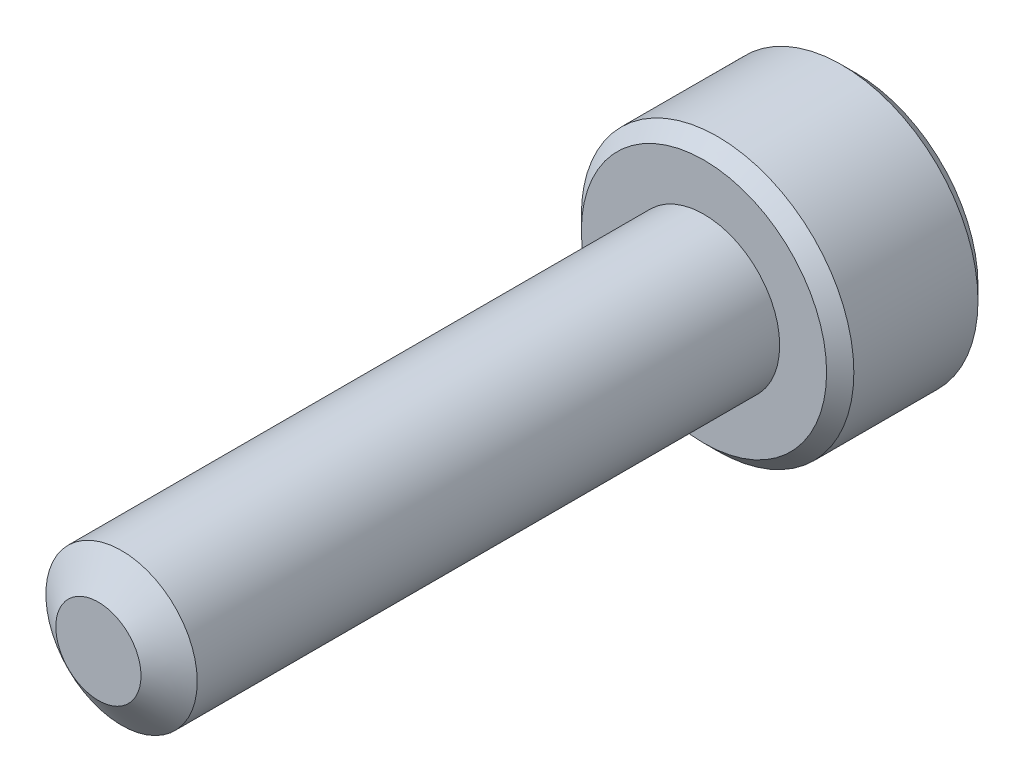
ISO-10303-21;
HEADER;
FILE_DESCRIPTION(('STEP AP214'),'2;1');
FILE_NAME('part.step','',(''),(''),'','','');
FILE_SCHEMA(('AUTOMOTIVE_DESIGN { 1 0 10303 214 1 1 1 1 }'));
ENDSEC;
DATA;
#1=APPLICATION_CONTEXT('core data for automotive mechanical design processes');
#2=APPLICATION_PROTOCOL_DEFINITION('international standard','automotive_design',2000,#1);
#3=PRODUCT_CONTEXT('',#1,'mechanical');
#4=PRODUCT('Part','Part','',(#3));
#5=PRODUCT_RELATED_PRODUCT_CATEGORY('part','',(#4));
#6=PRODUCT_DEFINITION_FORMATION('','',#4);
#7=PRODUCT_DEFINITION_CONTEXT('part definition',#1,'design');
#8=PRODUCT_DEFINITION('design','',#6,#7);
#9=PRODUCT_DEFINITION_SHAPE('','',#8);
#10=(LENGTH_UNIT() NAMED_UNIT(*) SI_UNIT(.MILLI.,.METRE.));
#11=(NAMED_UNIT(*) PLANE_ANGLE_UNIT() SI_UNIT($,.RADIAN.));
#12=(NAMED_UNIT(*) SI_UNIT($,.STERADIAN.) SOLID_ANGLE_UNIT());
#13=UNCERTAINTY_MEASURE_WITH_UNIT(LENGTH_MEASURE(1.E-05),#10,'distance_accuracy_value','');
#14=(GEOMETRIC_REPRESENTATION_CONTEXT(3) GLOBAL_UNCERTAINTY_ASSIGNED_CONTEXT((#13)) GLOBAL_UNIT_ASSIGNED_CONTEXT((#10,
#11,#12)) REPRESENTATION_CONTEXT('',''));
#15=CARTESIAN_POINT('',(0.,0.,0.));
#16=DIRECTION('',(0.,0.,1.));
#17=DIRECTION('',(1.,0.,0.));
#18=AXIS2_PLACEMENT_3D('',#15,#16,#17);
#19=CARTESIAN_POINT('',(0.,0.,-9.99999999999999));
#20=DIRECTION('',(0.,0.,1.));
#21=DIRECTION('',(1.00000000000001,0.,0.));
#22=AXIS2_PLACEMENT_3D('',#19,#20,#21);
#23=CYLINDRICAL_SURFACE('',#22,1.25);
#24=CARTESIAN_POINT('',(0.,0.,-9.99999999999999));
#25=DIRECTION('',(0.,0.,-1.));
#26=DIRECTION('',(-1.00000000000001,0.,0.));
#27=AXIS2_PLACEMENT_3D('',#24,#25,#26);
#28=CIRCLE('',#27,1.25);
#29=CARTESIAN_POINT('',(1.25000000000001,0.,-9.99999999999999));
#30=VERTEX_POINT('',#29);
#31=EDGE_CURVE('E212',#30,#30,#28,.F.);
#32=CARTESIAN_POINT('',(0.,0.,-0.382511876358974));
#33=DIRECTION('',(0.,0.,1.));
#34=DIRECTION('',(1.00000000000001,0.,0.));
#35=AXIS2_PLACEMENT_3D('',#32,#33,#34);
#36=CIRCLE('',#35,1.25);
#37=CARTESIAN_POINT('',(1.25000000000001,0.,-0.382511876358975));
#38=VERTEX_POINT('',#37);
#39=EDGE_CURVE('E106',#38,#38,#36,.T.);
#40=CARTESIAN_POINT('',(1.25000000000001,0.,-9.99999999999999));
#41=CARTESIAN_POINT('',(1.25000000000001,0.,-9.8998178320454));
#42=CARTESIAN_POINT('',(1.25000000000001,0.,-9.7996356640908));
#43=CARTESIAN_POINT('',(1.25000000000001,0.,-9.59927132818161));
#44=CARTESIAN_POINT('',(1.25000000000001,0.,-9.49908916022702));
#45=CARTESIAN_POINT('',(1.25000000000001,0.,-9.29872482431783));
#46=CARTESIAN_POINT('',(1.25000000000001,0.,-9.19854265636324));
#47=CARTESIAN_POINT('',(1.25000000000001,0.,-8.99817832045405));
#48=CARTESIAN_POINT('',(1.25000000000001,0.,-8.89799615249946));
#49=CARTESIAN_POINT('',(1.25000000000001,0.,-8.69763181659027));
#50=CARTESIAN_POINT('',(1.25000000000001,0.,-8.59744964863567));
#51=CARTESIAN_POINT('',(1.25000000000001,0.,-8.39708531272649));
#52=CARTESIAN_POINT('',(1.25000000000001,0.,-8.29690314477189));
#53=CARTESIAN_POINT('',(1.25000000000001,0.,-8.0965388088627));
#54=CARTESIAN_POINT('',(1.25000000000001,0.,-7.99635664090811));
#55=CARTESIAN_POINT('',(1.25000000000001,0.,-7.79599230499892));
#56=CARTESIAN_POINT('',(1.25000000000001,0.,-7.69581013704433));
#57=CARTESIAN_POINT('',(1.25000000000001,0.,-7.49544580113514));
#58=CARTESIAN_POINT('',(1.25000000000001,0.,-7.39526363318055));
#59=CARTESIAN_POINT('',(1.25000000000001,0.,-7.19489929727136));
#60=CARTESIAN_POINT('',(1.25000000000001,0.,-7.09471712931677));
#61=CARTESIAN_POINT('',(1.25000000000001,0.,-6.89435279340758));
#62=CARTESIAN_POINT('',(1.25000000000001,0.,-6.79417062545298));
#63=CARTESIAN_POINT('',(1.25000000000001,0.,-6.5938062895438));
#64=CARTESIAN_POINT('',(1.25000000000001,0.,-6.4936241215892));
#65=CARTESIAN_POINT('',(1.25000000000001,0.,-6.29325978568002));
#66=CARTESIAN_POINT('',(1.25000000000001,0.,-6.19307761772542));
#67=CARTESIAN_POINT('',(1.25000000000001,0.,-5.99271328181623));
#68=CARTESIAN_POINT('',(1.25000000000001,0.,-5.89253111386164));
#69=CARTESIAN_POINT('',(1.25000000000001,0.,-5.69216677795245));
#70=CARTESIAN_POINT('',(1.25000000000001,0.,-5.59198460999786));
#71=CARTESIAN_POINT('',(1.25000000000001,0.,-5.39162027408867));
#72=CARTESIAN_POINT('',(1.25000000000001,0.,-5.29143810613408));
#73=CARTESIAN_POINT('',(1.25000000000001,0.,-5.09107377022489));
#74=CARTESIAN_POINT('',(1.25000000000001,0.,-4.99089160227029));
#75=CARTESIAN_POINT('',(1.25000000000001,0.,-4.79052726636111));
#76=CARTESIAN_POINT('',(1.25000000000001,0.,-4.69034509840651));
#77=CARTESIAN_POINT('',(1.25000000000001,0.,-4.48998076249732));
#78=CARTESIAN_POINT('',(1.25000000000001,0.,-4.38979859454273));
#79=CARTESIAN_POINT('',(1.25000000000001,0.,-4.18943425863354));
#80=CARTESIAN_POINT('',(1.25000000000001,0.,-4.08925209067895));
#81=CARTESIAN_POINT('',(1.25000000000001,0.,-3.88888775476976));
#82=CARTESIAN_POINT('',(1.25000000000001,0.,-3.78870558681517));
#83=CARTESIAN_POINT('',(1.25000000000001,0.,-3.58834125090598));
#84=CARTESIAN_POINT('',(1.25000000000001,0.,-3.48815908295139));
#85=CARTESIAN_POINT('',(1.25000000000001,0.,-3.2877947470422));
#86=CARTESIAN_POINT('',(1.25000000000001,0.,-3.1876125790876));
#87=CARTESIAN_POINT('',(1.25000000000001,0.,-2.98724824317841));
#88=CARTESIAN_POINT('',(1.25000000000001,0.,-2.88706607522382));
#89=CARTESIAN_POINT('',(1.25000000000001,0.,-2.68670173931463));
#90=CARTESIAN_POINT('',(1.25000000000001,0.,-2.58651957136004));
#91=CARTESIAN_POINT('',(1.25000000000001,0.,-2.38615523545085));
#92=CARTESIAN_POINT('',(1.25000000000001,0.,-2.28597306749626));
#93=CARTESIAN_POINT('',(1.25000000000001,0.,-2.08560873158707));
#94=CARTESIAN_POINT('',(1.25000000000001,0.,-1.98542656363248));
#95=CARTESIAN_POINT('',(1.25000000000001,0.,-1.78506222772329));
#96=CARTESIAN_POINT('',(1.25000000000001,0.,-1.6848800597687));
#97=CARTESIAN_POINT('',(1.25000000000001,0.,-1.48451572385951));
#98=CARTESIAN_POINT('',(1.25000000000001,0.,-1.38433355590491));
#99=CARTESIAN_POINT('',(1.25000000000001,0.,-1.18396921999573));
#100=CARTESIAN_POINT('',(1.25000000000001,0.,-1.08378705204113));
#101=CARTESIAN_POINT('',(1.25000000000001,0.,-0.883422716131945));
#102=CARTESIAN_POINT('',(1.25000000000001,0.,-0.783240548177351));
#103=CARTESIAN_POINT('',(1.25000000000001,0.,-0.582876212268163));
#104=CARTESIAN_POINT('',(1.25000000000001,0.,-0.482694044313569));
#105=CARTESIAN_POINT('',(1.25000000000001,0.,-0.382511876358975));
#106=B_SPLINE_CURVE_WITH_KNOTS('',3,(#40,#41,#42,#43,#44,#45,#46,#47,#48,#49,#50,#51,#52,#53,
#54,#55,#56,#57,#58,#59,#60,#61,#62,#63,#64,#65,#66,#67,#68,#69,#70,#71,#72,#73,#74,#75,#76,#77,
#78,#79,#80,#81,#82,#83,#84,#85,#86,#87,#88,#89,#90,#91,#92,#93,#94,#95,#96,#97,#98,#99,#100,
#101,#102,#103,#104,#105),.UNSPECIFIED.,.F.,.F.,(4,2,2,2,2,2,2,2,2,2,2,2,2,2,2,2,2,2,2,2,2,2,2,
2,2,2,2,2,2,2,2,2,4),(0.,0.300546503863783,0.601093007727564,0.901639511591347,1.20218601545513,
1.50273251931891,1.80327902318269,2.10382552704647,2.40437203091025,2.70491853477404,
3.00546503863782,3.3060115425016,3.60655804636538,3.90710455022916,4.20765105409294,
4.50819755795673,4.80874406182051,5.10929056568429,5.40983706954807,5.71038357341185,
6.01093007727563,6.31147658113942,6.6120230850032,6.91256958886698,7.21311609273076,
7.51366259659454,7.81420910045832,8.11475560432211,8.41530210818589,8.71584861204967,
9.01639511591345,9.31694161977723,9.61748812364101),.UNSPECIFIED.);
#107=EDGE_CURVE('BSEAM32',#30,#38,#106,.T.);
#108=ORIENTED_EDGE('',*,*,#31,.T.);
#109=ORIENTED_EDGE('',*,*,#39,.F.);
#110=ORIENTED_EDGE('',*,*,#107,.T.);
#111=ORIENTED_EDGE('',*,*,#107,.F.);
#112=EDGE_LOOP('',(#108,#110,#109,#111));
#113=FACE_BOUND('',#112,.T.);
#114=ADVANCED_FACE('F32',(#113),#23,.T.);
#115=CARTESIAN_POINT('',(0.,0.,0.));
#116=DIRECTION('',(0.,0.,-1.));
#117=DIRECTION('',(-1.00000000000001,0.,0.));
#118=AXIS2_PLACEMENT_3D('',#115,#116,#117);
#119=CONICAL_SURFACE('',#118,0.70371642622275,0.959931088596884);
#120=ORIENTED_EDGE('',*,*,#39,.T.);
#121=EDGE_LOOP('',(#120));
#122=FACE_BOUND('',#121,.T.);
#123=CARTESIAN_POINT('',(0.,0.,0.));
#124=DIRECTION('',(0.,0.,1.));
#125=DIRECTION('',(1.00000000000001,0.,0.));
#126=AXIS2_PLACEMENT_3D('',#123,#124,#125);
#127=CIRCLE('',#126,0.70371642622275);
#128=CARTESIAN_POINT('',(0.703716426222755,0.,0.));
#129=VERTEX_POINT('',#128);
#130=EDGE_CURVE('E210',#129,#129,#127,.T.);
#131=ORIENTED_EDGE('',*,*,#130,.F.);
#132=EDGE_LOOP('',(#131));
#133=FACE_BOUND('',#132,.T.);
#134=ADVANCED_FACE('F193',(#122,#133),#119,.T.);
#135=CARTESIAN_POINT('',(0.,0.,0.));
#136=DIRECTION('',(0.,0.,1.));
#137=DIRECTION('',(1.00000000000001,0.,0.));
#138=AXIS2_PLACEMENT_3D('',#135,#136,#137);
#139=PLANE('',#138);
#140=ORIENTED_EDGE('',*,*,#130,.T.);
#141=EDGE_LOOP('',(#140));
#142=FACE_BOUND('',#141,.T.);
#143=ADVANCED_FACE('F190',(#142),#139,.T.);
#144=CARTESIAN_POINT('',(0.,1.38777878078145E-13,-12.5000000000001));
#145=DIRECTION('',(0.,0.,1.));
#146=DIRECTION('',(1.00000000000001,0.,0.));
#147=AXIS2_PLACEMENT_3D('',#144,#145,#146);
#148=CYLINDRICAL_SURFACE('',#147,2.25);
#149=CARTESIAN_POINT('',(0.,1.38777878078145E-13,-12.275));
#150=DIRECTION('',(0.,0.,-1.));
#151=DIRECTION('',(-1.00000000000001,0.,0.));
#152=AXIS2_PLACEMENT_3D('',#149,#150,#151);
#153=CIRCLE('',#152,2.25);
#154=CARTESIAN_POINT('',(2.25,1.40282924165902E-13,-12.275));
#155=VERTEX_POINT('',#154);
#156=EDGE_CURVE('E40',#155,#155,#153,.F.);
#157=CARTESIAN_POINT('',(0.,1.76941794549634E-13,-10.225));
#158=DIRECTION('',(0.,0.,-1.));
#159=DIRECTION('',(-1.00000000000001,0.,0.));
#160=AXIS2_PLACEMENT_3D('',#157,#158,#159);
#161=CIRCLE('',#160,2.25);
#162=CARTESIAN_POINT('',(2.25,1.40339823095914E-13,-10.225));
#163=VERTEX_POINT('',#162);
#164=EDGE_CURVE('E169',#163,#163,#161,.T.);
#165=CARTESIAN_POINT('',(2.25,1.40282924165902E-13,-12.275));
#166=CARTESIAN_POINT('',(2.25,1.4028351686309E-13,-12.2536458333334));
#167=CARTESIAN_POINT('',(2.25,1.40284109560277E-13,-12.2322916666667));
#168=CARTESIAN_POINT('',(2.25,1.40285294954653E-13,-12.1895833333334));
#169=CARTESIAN_POINT('',(2.25,1.4028588765184E-13,-12.1682291666667));
#170=CARTESIAN_POINT('',(2.25,1.40287073046215E-13,-12.1255208333334));
#171=CARTESIAN_POINT('',(2.25,1.40287665743403E-13,-12.1041666666667));
#172=CARTESIAN_POINT('',(2.25,1.40288851137778E-13,-12.0614583333334));
#173=CARTESIAN_POINT('',(2.25,1.40289443834966E-13,-12.0401041666667));
#174=CARTESIAN_POINT('',(2.25,1.40290629229341E-13,-11.9973958333334));
#175=CARTESIAN_POINT('',(2.25,1.40291221926529E-13,-11.9760416666667));
#176=CARTESIAN_POINT('',(2.25,1.40292407320904E-13,-11.9333333333334));
#177=CARTESIAN_POINT('',(2.25,1.40293000018092E-13,-11.9119791666667));
#178=CARTESIAN_POINT('',(2.25,1.40294185412467E-13,-11.8692708333334));
#179=CARTESIAN_POINT('',(2.25,1.40294778109655E-13,-11.8479166666667));
#180=CARTESIAN_POINT('',(2.25,1.4029596350403E-13,-11.8052083333334));
#181=CARTESIAN_POINT('',(2.25,1.40296556201217E-13,-11.7838541666667));
#182=CARTESIAN_POINT('',(2.25,1.40297741595593E-13,-11.7411458333334));
#183=CARTESIAN_POINT('',(2.25,1.4029833429278E-13,-11.7197916666667));
#184=CARTESIAN_POINT('',(2.25,1.40299519687156E-13,-11.6770833333334));
#185=CARTESIAN_POINT('',(2.25,1.40300112384343E-13,-11.6557291666667));
#186=CARTESIAN_POINT('',(2.25,1.40301297778718E-13,-11.6130208333334));
#187=CARTESIAN_POINT('',(2.25,1.40301890475906E-13,-11.5916666666667));
#188=CARTESIAN_POINT('',(2.25,1.40303075870281E-13,-11.5489583333334));
#189=CARTESIAN_POINT('',(2.25,1.40303668567469E-13,-11.5276041666667));
#190=CARTESIAN_POINT('',(2.25,1.40304853961844E-13,-11.4848958333334));
#191=CARTESIAN_POINT('',(2.25,1.40305446659032E-13,-11.4635416666667));
#192=CARTESIAN_POINT('',(2.25,1.40306632053407E-13,-11.4208333333334));
#193=CARTESIAN_POINT('',(2.25,1.40307224750595E-13,-11.3994791666667));
#194=CARTESIAN_POINT('',(2.25,1.4030841014497E-13,-11.3567708333334));
#195=CARTESIAN_POINT('',(2.25,1.40309002842158E-13,-11.3354166666667));
#196=CARTESIAN_POINT('',(2.25,1.40310188236533E-13,-11.2927083333334));
#197=CARTESIAN_POINT('',(2.25,1.4031078093372E-13,-11.2713541666667));
#198=CARTESIAN_POINT('',(2.25,1.40311966328096E-13,-11.2286458333334));
#199=CARTESIAN_POINT('',(2.25,1.40312559025283E-13,-11.2072916666667));
#200=CARTESIAN_POINT('',(2.25,1.40313744419659E-13,-11.1645833333334));
#201=CARTESIAN_POINT('',(2.25,1.40314337116846E-13,-11.1432291666667));
#202=CARTESIAN_POINT('',(2.25,1.40315522511221E-13,-11.1005208333334));
#203=CARTESIAN_POINT('',(2.25,1.40316115208409E-13,-11.0791666666667));
#204=CARTESIAN_POINT('',(2.25,1.40317300602784E-13,-11.0364583333334));
#205=CARTESIAN_POINT('',(2.25,1.40317893299972E-13,-11.0151041666667));
#206=CARTESIAN_POINT('',(2.25,1.40319078694347E-13,-10.9723958333334));
#207=CARTESIAN_POINT('',(2.25,1.40319671391535E-13,-10.9510416666667));
#208=CARTESIAN_POINT('',(2.25,1.4032085678591E-13,-10.9083333333334));
#209=CARTESIAN_POINT('',(2.25,1.40321449483098E-13,-10.8869791666667));
#210=CARTESIAN_POINT('',(2.25,1.40322634877473E-13,-10.8442708333334));
#211=CARTESIAN_POINT('',(2.25,1.40323227574661E-13,-10.8229166666667));
#212=CARTESIAN_POINT('',(2.25,1.40324412969036E-13,-10.7802083333334));
#213=CARTESIAN_POINT('',(2.25,1.40325005666223E-13,-10.7588541666667));
#214=CARTESIAN_POINT('',(2.25,1.40326191060599E-13,-10.7161458333334));
#215=CARTESIAN_POINT('',(2.25,1.40326783757786E-13,-10.6947916666667));
#216=CARTESIAN_POINT('',(2.25,1.40327969152162E-13,-10.6520833333334));
#217=CARTESIAN_POINT('',(2.25,1.40328561849349E-13,-10.6307291666667));
#218=CARTESIAN_POINT('',(2.25,1.40329747243724E-13,-10.5880208333334));
#219=CARTESIAN_POINT('',(2.25,1.40330339940912E-13,-10.5666666666667));
#220=CARTESIAN_POINT('',(2.25,1.40331525335287E-13,-10.5239583333334));
#221=CARTESIAN_POINT('',(2.25,1.40332118032475E-13,-10.5026041666667));
#222=CARTESIAN_POINT('',(2.25,1.4033330342685E-13,-10.4598958333334));
#223=CARTESIAN_POINT('',(2.25,1.40333896124038E-13,-10.4385416666667));
#224=CARTESIAN_POINT('',(2.25,1.40335081518413E-13,-10.3958333333334));
#225=CARTESIAN_POINT('',(2.25,1.40335674215601E-13,-10.3744791666667));
#226=CARTESIAN_POINT('',(2.25,1.40336859609976E-13,-10.3317708333334));
#227=CARTESIAN_POINT('',(2.25,1.40337452307164E-13,-10.3104166666667));
#228=CARTESIAN_POINT('',(2.25,1.40338637701539E-13,-10.2677083333334));
#229=CARTESIAN_POINT('',(2.25,1.40339230398726E-13,-10.2463541666667));
#230=CARTESIAN_POINT('',(2.25,1.40339823095914E-13,-10.225));
#231=B_SPLINE_CURVE_WITH_KNOTS('',3,(#165,#166,#167,#168,#169,#170,#171,#172,#173,#174,#175,
#176,#177,#178,#179,#180,#181,#182,#183,#184,#185,#186,#187,#188,#189,#190,#191,#192,#193,#194,
#195,#196,#197,#198,#199,#200,#201,#202,#203,#204,#205,#206,#207,#208,#209,#210,#211,#212,#213,
#214,#215,#216,#217,#218,#219,#220,#221,#222,#223,#224,#225,#226,#227,#228,#229,#230),
.UNSPECIFIED.,.F.,.F.,(4,2,2,2,2,2,2,2,2,2,2,2,2,2,2,2,2,2,2,2,2,2,2,2,2,2,2,2,2,2,2,2,4),(0.,
0.0640624999999999,0.128124999999998,0.192187499999998,0.256249999999996,0.320312499999996,
0.384374999999994,0.448437499999994,0.512499999999992,0.576562499999992,0.64062499999999,
0.70468749999999,0.768749999999988,0.832812499999988,0.896874999999986,0.960937499999986,
1.02499999999998,1.08906249999998,1.15312499999998,1.21718749999998,1.28124999999998,
1.34531249999998,1.40937499999998,1.47343749999998,1.53749999999998,1.60156249999998,
1.66562499999997,1.72968749999997,1.79374999999997,1.85781249999997,1.92187499999997,
1.98593749999997,2.04999999999997),.UNSPECIFIED.);
#232=EDGE_CURVE('BSEAM174',#155,#163,#231,.T.);
#233=ORIENTED_EDGE('',*,*,#156,.T.);
#234=ORIENTED_EDGE('',*,*,#164,.T.);
#235=ORIENTED_EDGE('',*,*,#232,.T.);
#236=ORIENTED_EDGE('',*,*,#232,.F.);
#237=EDGE_LOOP('',(#233,#235,#234,#236));
#238=FACE_BOUND('',#237,.T.);
#239=ADVANCED_FACE('F174',(#238),#148,.T.);
#240=CARTESIAN_POINT('',(0.,1.38777878078145E-13,-12.5000000000001));
#241=DIRECTION('',(0.,0.,-1.));
#242=DIRECTION('',(-1.00000000000001,0.,0.));
#243=AXIS2_PLACEMENT_3D('',#240,#241,#242);
#244=PLANE('',#243);
#245=CARTESIAN_POINT('',(0.,1.38777878078145E-13,-12.5000000000001));
#246=DIRECTION('',(0.,0.,-1.));
#247=DIRECTION('',(-1.00000000000001,0.,0.));
#248=AXIS2_PLACEMENT_3D('',#245,#246,#247);
#249=CIRCLE('',#248,2.025);
#250=CARTESIAN_POINT('',(2.025,1.40126799053064E-13,-12.5000000000001));
#251=VERTEX_POINT('',#250);
#252=EDGE_CURVE('E105',#251,#251,#249,.T.);
#253=ORIENTED_EDGE('',*,*,#252,.T.);
#254=EDGE_LOOP('',(#253));
#255=FACE_BOUND('',#254,.T.);
#256=CARTESIAN_POINT('',(0.,1.38777878078145E-13,-12.5000000000001));
#257=DIRECTION('',(0.,0.,-1.));
#258=DIRECTION('',(-1.00000000000001,0.,0.));
#259=AXIS2_PLACEMENT_3D('',#256,#257,#258);
#260=CIRCLE('',#259,1.15470053837925);
#261=CARTESIAN_POINT('',(-0.999999999999973,0.577350269189793,-12.5));
#262=VERTEX_POINT('',#261);
#263=CARTESIAN_POINT('',(0.,1.15470053837944,-12.5));
#264=VERTEX_POINT('',#263);
#265=EDGE_CURVE('E86',#262,#264,#260,.T.);
#266=ORIENTED_EDGE('',*,*,#265,.F.);
#267=CARTESIAN_POINT('',(-0.999999999999966,-0.577350269189411,-12.5));
#268=VERTEX_POINT('',#267);
#269=EDGE_CURVE('E46',#268,#262,#260,.T.);
#270=ORIENTED_EDGE('',*,*,#269,.F.);
#271=CARTESIAN_POINT('',(0.,-1.1547005383791,-12.4999999999998));
#272=VERTEX_POINT('',#271);
#273=EDGE_CURVE('E271',#272,#268,#260,.T.);
#274=ORIENTED_EDGE('',*,*,#273,.F.);
#275=CARTESIAN_POINT('',(1.00000000000001,-0.577350269189422,-12.4999999999999));
#276=VERTEX_POINT('',#275);
#277=EDGE_CURVE('E53',#276,#272,#260,.T.);
#278=ORIENTED_EDGE('',*,*,#277,.F.);
#279=CARTESIAN_POINT('',(1.00000000000002,0.577350269189848,-12.5));
#280=VERTEX_POINT('',#279);
#281=EDGE_CURVE('E127',#280,#276,#260,.T.);
#282=ORIENTED_EDGE('',*,*,#281,.F.);
#283=EDGE_CURVE('E95',#264,#280,#260,.T.);
#284=ORIENTED_EDGE('',*,*,#283,.F.);
#285=EDGE_LOOP('',(#266,#270,#274,#278,#282,#284));
#286=FACE_BOUND('',#285,.T.);
#287=ADVANCED_FACE('F126',(#255,#286),#244,.T.);
#288=CARTESIAN_POINT('',(0.,0.,-9.99999999999999));
#289=DIRECTION('',(0.,0.,-1.));
#290=DIRECTION('',(-1.00000000000001,0.,0.));
#291=AXIS2_PLACEMENT_3D('',#288,#289,#290);
#292=PLANE('',#291);
#293=CARTESIAN_POINT('',(0.,0.,-9.99999999999999));
#294=DIRECTION('',(0.,0.,-1.));
#295=DIRECTION('',(-1.00000000000001,0.,0.));
#296=AXIS2_PLACEMENT_3D('',#293,#294,#295);
#297=CIRCLE('',#296,2.025);
#298=CARTESIAN_POINT('',(-2.02500000000001,0.,-9.99999999999999));
#299=VERTEX_POINT('',#298);
#300=EDGE_CURVE('E11',#299,#299,#297,.F.);
#301=ORIENTED_EDGE('',*,*,#300,.T.);
#302=EDGE_LOOP('',(#301));
#303=FACE_BOUND('',#302,.T.);
#304=ORIENTED_EDGE('',*,*,#31,.F.);
#305=EDGE_LOOP('',(#304));
#306=FACE_BOUND('',#305,.T.);
#307=ADVANCED_FACE('F183',(#303,#306),#292,.F.);
#308=CARTESIAN_POINT('',(0.,1.38777878078145E-13,-12.5000000000001));
#309=DIRECTION('',(0.,0.,-1.));
#310=DIRECTION('',(-1.00000000000001,0.,0.));
#311=AXIS2_PLACEMENT_3D('',#308,#309,#310);
#312=CONICAL_SURFACE('',#311,1.15470053837925,0.78539816339745);
#313=ORIENTED_EDGE('',*,*,#283,.T.);
#314=CARTESIAN_POINT('',(-0.000199999999998812,1.15481600843326,-12.5001154873727));
#315=CARTESIAN_POINT('',(0.0341825950072074,1.13496520795043,-12.4802779308258));
#316=CARTESIAN_POINT('',(0.0691401181398583,1.1147824725596,-12.461605020639));
#317=CARTESIAN_POINT('',(0.140422802956135,1.07362739529237,-12.4274147427233));
#318=CARTESIAN_POINT('',(0.176754750529035,1.05265113558097,-12.4119164090236));
#319=CARTESIAN_POINT('',(0.250016613803374,1.0103533790982,-12.3853673071424));
#320=CARTESIAN_POINT('',(0.286927851445483,0.98904266610941,-12.3742497739971));
#321=CARTESIAN_POINT('',(0.361562729310906,0.945952199282854,-12.3571198657763));
#322=CARTESIAN_POINT('',(0.399284088108655,0.92417376262675,-12.3510946974667));
#323=CARTESIAN_POINT('',(0.464292198417939,0.886641312640185,-12.3456605549675));
#324=CARTESIAN_POINT('',(0.491494371528181,0.870936130672463,-12.3448569383168));
#325=CARTESIAN_POINT('',(0.545846040669118,0.839556179863051,-12.3462066994171));
#326=CARTESIAN_POINT('',(0.572995523754875,0.823881418495125,-12.3483607295473));
#327=CARTESIAN_POINT('',(0.654056277326952,0.777080970599568,-12.3591169721286));
#328=CARTESIAN_POINT('',(0.707564140978433,0.746188191116638,-12.3720145564154));
#329=CARTESIAN_POINT('',(0.801476065143428,0.691968116419863,-12.4031407306022));
#330=CARTESIAN_POINT('',(0.842320523671816,0.668386557293585,-12.4197377977019));
#331=CARTESIAN_POINT('',(0.92240963738192,0.622147085933891,-12.4571249246854));
#332=CARTESIAN_POINT('',(0.961659010870423,0.59948644958478,-12.4779013418175));
#333=CARTESIAN_POINT('',(1.00020000000003,0.577234799135983,-12.5001154873726));
#334=B_SPLINE_CURVE_WITH_KNOTS('',3,(#314,#315,#316,#317,#318,#319,#320,#321,#322,#323,#324,
#325,#326,#327,#328,#329,#330,#331,#332,#333),.UNSPECIFIED.,.F.,.F.,(4,2,2,2,2,2,2,2,2,4),(0.,
0.133237676828546,0.26725222983451,0.399137076269317,0.530689603280759,0.624814864263811,
0.718960890149088,0.907306626112032,1.05710100361783,1.2064141151928),.UNSPECIFIED.);
#335=EDGE_CURVE('E100',#264,#280,#334,.T.);
#336=ORIENTED_EDGE('',*,*,#335,.F.);
#337=EDGE_LOOP('',(#313,#336));
#338=FACE_BOUND('',#337,.T.);
#339=ADVANCED_FACE('F101',(#338),#312,.F.);
#340=ORIENTED_EDGE('',*,*,#281,.T.);
#341=CARTESIAN_POINT('',(1.,-1.15147208646445,-12.8703856775137));
#342=CARTESIAN_POINT('',(1.00000000000001,-1.12343447988529,-12.8492199198736));
#343=CARTESIAN_POINT('',(1.00000000000001,-1.09524064850672,-12.8282616921759));
#344=CARTESIAN_POINT('',(1.00000000000001,-1.0384771564435,-12.7868460222357));
#345=CARTESIAN_POINT('',(1.00000000000001,-1.00990740382951,-12.7663887061237));
#346=CARTESIAN_POINT('',(1.00000000000001,-0.923120894333248,-12.7056047949545));
#347=CARTESIAN_POINT('',(1.00000000000001,-0.864253173758822,-12.6661922289614));
#348=CARTESIAN_POINT('',(1.00000000000001,-0.740809858257768,-12.5888206642002));
#349=CARTESIAN_POINT('',(1.,-0.676100255137495,-12.5510730391144));
#350=CARTESIAN_POINT('',(1.00000000000002,-0.543448939048875,-12.4820245875512));
#351=CARTESIAN_POINT('',(1.00000000000004,-0.475519112027627,-12.4507020278466));
#352=CARTESIAN_POINT('',(1.00000000000002,-0.373555850333348,-12.4123817788837));
#353=CARTESIAN_POINT('',(1.00000000000001,-0.341031989670696,-12.4013835916422));
#354=CARTESIAN_POINT('',(1.,-0.275199079052064,-12.3819983421475));
#355=CARTESIAN_POINT('',(1.00000000000001,-0.241889975173717,-12.3736114597768));
#356=CARTESIAN_POINT('',(1.00000000000001,-0.175247517042792,-12.3600252207191));
#357=CARTESIAN_POINT('',(1.00000000000001,-0.141925568217976,-12.3547707907681));
#358=CARTESIAN_POINT('',(1.00000000000001,-0.0749144362320993,-12.3475486865709));
#359=CARTESIAN_POINT('',(1.00000000000001,-0.0412251978499984,-12.3455815136104));
#360=CARTESIAN_POINT('',(1.00000000000001,0.0249580992635524,-12.3450831983931));
#361=CARTESIAN_POINT('',(1.00000000000001,0.0574512826461549,-12.3464302678887));
#362=CARTESIAN_POINT('',(1.00000000000001,0.12214850570196,-12.3522164844991));
#363=CARTESIAN_POINT('',(1.00000000000001,0.154352610133013,-12.3566549206616));
#364=CARTESIAN_POINT('',(1.00000000000001,0.218799898867712,-12.3684568301453));
#365=CARTESIAN_POINT('',(1.,0.251033743269019,-12.3758705410386));
#366=CARTESIAN_POINT('',(1.00000000000001,0.314797132354977,-12.3932289424987));
#367=CARTESIAN_POINT('',(1.00000000000003,0.346326735731063,-12.4031734212889));
#368=CARTESIAN_POINT('',(1.00000000000006,0.445594187730275,-12.4382234825543));
#369=CARTESIAN_POINT('',(1.00000000000002,0.511919139476095,-12.4673208583568));
#370=CARTESIAN_POINT('',(0.999999999999994,0.641453244657602,-12.5320153296866));
#371=CARTESIAN_POINT('',(1.,0.704650133126438,-12.5676357767153));
#372=CARTESIAN_POINT('',(1.00000000000001,0.825428490175112,-12.641123901347));
#373=CARTESIAN_POINT('',(1.00000000000001,0.88313294786782,-12.6787919471355));
#374=CARTESIAN_POINT('',(1.00000000000001,0.968148853704697,-12.7370228529433));
#375=CARTESIAN_POINT('',(1.00000000000001,0.99612057038041,-12.7566384757629));
#376=CARTESIAN_POINT('',(1.00000000000001,1.05168177729915,-12.7963885170613));
#377=CARTESIAN_POINT('',(1.,1.07927136997715,-12.8165227921989));
#378=CARTESIAN_POINT('',(0.999999999999987,1.10670185346348,-12.836872119073));
#379=B_SPLINE_CURVE_WITH_KNOTS('',3,(#341,#342,#343,#344,#345,#346,#347,#348,#349,#350,#351,
#352,#353,#354,#355,#356,#357,#358,#359,#360,#361,#362,#363,#364,#365,#366,#367,#368,#369,#370,
#371,#372,#373,#374,#375,#376,#377,#378),.UNSPECIFIED.,.F.,.F.,(4,2,2,2,2,2,2,2,2,2,2,2,2,2,2,2,
2,2,4),(0.,0.105386459083252,0.210799187330055,0.423233611565427,0.647793540908492,
0.871580877738562,0.974493074181341,1.07741235827192,1.17846428203194,1.27953161415748,
1.37694086739593,1.47432772585387,1.57343322804271,1.67253043972826,1.88917353996805,
2.10660791038796,2.31323734249829,2.4157258923203,2.51818641476487),.UNSPECIFIED.);
#380=EDGE_CURVE('E94',#280,#276,#379,.F.);
#381=ORIENTED_EDGE('',*,*,#380,.F.);
#382=EDGE_LOOP('',(#340,#381));
#383=FACE_BOUND('',#382,.T.);
#384=ADVANCED_FACE('F277',(#383),#312,.F.);
#385=ORIENTED_EDGE('',*,*,#277,.T.);
#386=CARTESIAN_POINT('',(1.00020000000003,-0.577234799135601,-12.5001154873725));
#387=CARTESIAN_POINT('',(0.965817404992822,-0.597085599618466,-12.4802779308258));
#388=CARTESIAN_POINT('',(0.93085988186017,-0.617268335009308,-12.461605020639));
#389=CARTESIAN_POINT('',(0.859577197043886,-0.658423412276548,-12.4274147427232));
#390=CARTESIAN_POINT('',(0.823245249470979,-0.679399671987947,-12.4119164090235));
#391=CARTESIAN_POINT('',(0.749983386196627,-0.721697428470733,-12.3853673071423));
#392=CARTESIAN_POINT('',(0.713072148554513,-0.743008141459538,-12.3742497739971));
#393=CARTESIAN_POINT('',(0.63843727068907,-0.786098608286066,-12.3571198657762));
#394=CARTESIAN_POINT('',(0.600715911891306,-0.807877044942125,-12.3510946974665));
#395=CARTESIAN_POINT('',(0.535707801582038,-0.845409494928699,-12.3456605549674));
#396=CARTESIAN_POINT('',(0.508505628471816,-0.861114676896449,-12.3448569383167));
#397=CARTESIAN_POINT('',(0.454153959330899,-0.89249462770588,-12.346206699417));
#398=CARTESIAN_POINT('',(0.427004476245141,-0.908169389073797,-12.3483607295473));
#399=CARTESIAN_POINT('',(0.345943722673057,-0.954969836969341,-12.3591169721285));
#400=CARTESIAN_POINT('',(0.292435859021562,-0.985862616452287,-12.3720145564152));
#401=CARTESIAN_POINT('',(0.198523934856591,-1.04008269114905,-12.403140730602));
#402=CARTESIAN_POINT('',(0.15767947632823,-1.06366425027531,-12.4197377977018));
#403=CARTESIAN_POINT('',(0.0775903626181606,-1.10990372163499,-12.4571249246854));
#404=CARTESIAN_POINT('',(0.0383409891296635,-1.1325643579841,-12.4779013418175));
#405=CARTESIAN_POINT('',(-0.000199999999977996,-1.15481600843292,-12.5001154873724));
#406=B_SPLINE_CURVE_WITH_KNOTS('',3,(#386,#387,#388,#389,#390,#391,#392,#393,#394,#395,#396,
#397,#398,#399,#400,#401,#402,#403,#404,#405),.UNSPECIFIED.,.F.,.F.,(4,2,2,2,2,2,2,2,2,4),(0.,
0.133237676828526,0.267252229834521,0.399137076269359,0.530689603280804,0.624814864263834,
0.718960890149108,0.907306626112028,1.05710100361781,1.20641411519276),.UNSPECIFIED.);
#407=EDGE_CURVE('E137',#276,#272,#406,.T.);
#408=ORIENTED_EDGE('',*,*,#407,.F.);
#409=EDGE_LOOP('',(#385,#408));
#410=FACE_BOUND('',#409,.T.);
#411=ADVANCED_FACE('F274',(#410),#312,.F.);
#412=ORIENTED_EDGE('',*,*,#273,.T.);
#413=CARTESIAN_POINT('',(0.000200000000033507,-1.15481600843292,-12.5001154873724));
#414=CARTESIAN_POINT('',(-0.0341825950072117,-1.1349652079501,-12.4802779308257));
#415=CARTESIAN_POINT('',(-0.0691401181398675,-1.11478247255928,-12.461605020639));
#416=CARTESIAN_POINT('',(-0.140422802956142,-1.07362739529206,-12.4274147427233));
#417=CARTESIAN_POINT('',(-0.176754750529036,-1.05265113558066,-12.4119164090235));
#418=CARTESIAN_POINT('',(-0.25001661380338,-1.01035337909789,-12.3853673071424));
#419=CARTESIAN_POINT('',(-0.286927851445501,-0.989042666109095,-12.3742497739971));
#420=CARTESIAN_POINT('',(-0.36156272931092,-0.945952199282542,-12.3571198657762));
#421=CARTESIAN_POINT('',(-0.399284088108653,-0.924173762626446,-12.3510946974665));
#422=CARTESIAN_POINT('',(-0.464292198417928,-0.886641312639885,-12.3456605549674));
#423=CARTESIAN_POINT('',(-0.491494371528172,-0.870936130672162,-12.3448569383168));
#424=CARTESIAN_POINT('',(-0.545846040669112,-0.839556179862751,-12.3462066994171));
#425=CARTESIAN_POINT('',(-0.572995523754872,-0.823881418494827,-12.3483607295473));
#426=CARTESIAN_POINT('',(-0.654056277326956,-0.777080970599251,-12.3591169721285));
#427=CARTESIAN_POINT('',(-0.707564140978451,-0.746188191116268,-12.3720145564152));
#428=CARTESIAN_POINT('',(-0.801476065143441,-0.691968116419508,-12.403140730602));
#429=CARTESIAN_POINT('',(-0.842320523671816,-0.668386557293274,-12.4197377977018));
#430=CARTESIAN_POINT('',(-0.922409637381887,-0.62214708593361,-12.4571249246854));
#431=CARTESIAN_POINT('',(-0.96165901087037,-0.599486449584486,-12.4779013418176));
#432=CARTESIAN_POINT('',(-1.00019999999996,-0.577234799135584,-12.5001154873726));
#433=B_SPLINE_CURVE_WITH_KNOTS('',3,(#413,#414,#415,#416,#417,#418,#419,#420,#421,#422,#423,
#424,#425,#426,#427,#428,#429,#430,#431,#432),.UNSPECIFIED.,.F.,.F.,(4,2,2,2,2,2,2,2,2,4),(0.,
0.133237676828482,0.267252229834448,0.39913707626928,0.53068960328071,0.624814864263753,
0.718960890149046,0.907306626111987,1.05710100361779,1.20641411519278),.UNSPECIFIED.);
#434=EDGE_CURVE('E248',#272,#268,#433,.T.);
#435=ORIENTED_EDGE('',*,*,#434,.F.);
#436=EDGE_LOOP('',(#412,#435));
#437=FACE_BOUND('',#436,.T.);
#438=ADVANCED_FACE('F273',(#437),#312,.F.);
#439=ORIENTED_EDGE('',*,*,#269,.T.);
#440=CARTESIAN_POINT('',(-1.,-1.15147208663196,-12.8703856776402));
#441=CARTESIAN_POINT('',(-1.00000000000002,-1.12343448004811,-12.8492199199953));
#442=CARTESIAN_POINT('',(-1.00000000000003,-1.09524064866483,-12.8282616922926));
#443=CARTESIAN_POINT('',(-1.00000000000003,-1.03847715659214,-12.7868460223427));
#444=CARTESIAN_POINT('',(-1.00000000000003,-1.00990740397337,-12.7663887062259));
#445=CARTESIAN_POINT('',(-1.00000000000003,-0.92312089446254,-12.7056047950421));
#446=CARTESIAN_POINT('',(-1.00000000000003,-0.864253173878208,-12.6661922290393));
#447=CARTESIAN_POINT('',(-1.00000000000003,-0.740809858355566,-12.5888206642582));
#448=CARTESIAN_POINT('',(-1.00000000000002,-0.676100255223557,-12.5510730391622));
#449=CARTESIAN_POINT('',(-1.00000000000003,-0.543448939110391,-12.4820245875803));
#450=CARTESIAN_POINT('',(-1.00000000000005,-0.475519112076342,-12.4507020278671));
#451=CARTESIAN_POINT('',(-1.00000000000004,-0.373555850372491,-12.4123817788976));
#452=CARTESIAN_POINT('',(-1.00000000000003,-0.341031989713875,-12.4013835916563));
#453=CARTESIAN_POINT('',(-1.00000000000003,-0.275199079103422,-12.3819983421612));
#454=CARTESIAN_POINT('',(-1.00000000000003,-0.241889975229217,-12.37361145979));
#455=CARTESIAN_POINT('',(-1.00000000000003,-0.175247517106445,-12.3600252207302));
#456=CARTESIAN_POINT('',(-1.00000000000003,-0.141925568285637,-12.3547707907777));
#457=CARTESIAN_POINT('',(-1.00000000000003,-0.0749144363076371,-12.3475486865767));
#458=CARTESIAN_POINT('',(-1.00000000000003,-0.0412251979294057,-12.3455815136139));
#459=CARTESIAN_POINT('',(-1.00000000000003,0.024958099177011,-12.3450831983911));
#460=CARTESIAN_POINT('',(-1.00000000000003,0.0574512825563389,-12.3464302678836));
#461=CARTESIAN_POINT('',(-1.00000000000003,0.12214850560592,-12.3522164844875));
#462=CARTESIAN_POINT('',(-1.00000000000003,0.154352610034024,-12.3566549206466));
#463=CARTESIAN_POINT('',(-1.00000000000003,0.218799898762896,-12.3684568301229));
#464=CARTESIAN_POINT('',(-1.00000000000003,0.251033743161334,-12.3758705410124));
#465=CARTESIAN_POINT('',(-1.00000000000003,0.314797132241844,-12.3932289424648));
#466=CARTESIAN_POINT('',(-1.00000000000002,0.346326735615349,-12.403173421251));
#467=CARTESIAN_POINT('',(-1.00000000000001,0.445594187589344,-12.4382234824979));
#468=CARTESIAN_POINT('',(-1.00000000000002,0.511919139313772,-12.4673208582833));
#469=CARTESIAN_POINT('',(-1.00000000000003,0.64145324445416,-12.5320153295773));
#470=CARTESIAN_POINT('',(-1.00000000000003,0.704650132903279,-12.5676357765871));
#471=CARTESIAN_POINT('',(-1.00000000000003,0.825428489916507,-12.6411239011825));
#472=CARTESIAN_POINT('',(-1.00000000000003,0.883132947593358,-12.6787919469539));
#473=CARTESIAN_POINT('',(-1.00000000000003,0.968148853406802,-12.7370228527361));
#474=CARTESIAN_POINT('',(-1.00000000000003,0.996120570074818,-12.7566384755473));
#475=CARTESIAN_POINT('',(-1.00000000000003,1.05168177697819,-12.7963885168288));
#476=CARTESIAN_POINT('',(-1.00000000000004,1.07927136964853,-12.8165227919579));
#477=CARTESIAN_POINT('',(-1.00000000000006,1.1067018531272,-12.8368721188235));
#478=B_SPLINE_CURVE_WITH_KNOTS('',3,(#440,#441,#442,#443,#444,#445,#446,#447,#448,#449,#450,
#451,#452,#453,#454,#455,#456,#457,#458,#459,#460,#461,#462,#463,#464,#465,#466,#467,#468,#469,
#470,#471,#472,#473,#474,#475,#476,#477),.UNSPECIFIED.,.F.,.F.,(4,2,2,2,2,2,2,2,2,2,2,2,2,2,2,2,
2,2,4),(0.,0.10538645910332,0.210799187370194,0.42323361164641,0.647793541035274,
0.871580877910739,0.974493074341915,1.0774123584209,1.17846428216981,1.27953161428424,
1.37694086751253,1.47432772596031,1.57343322813819,1.6725304398128,1.88917353997368,
2.10660791031418,2.31323734235659,2.4157258921451,2.51818641455618),.UNSPECIFIED.);
#479=EDGE_CURVE('E116',#268,#262,#478,.T.);
#480=ORIENTED_EDGE('',*,*,#479,.F.);
#481=EDGE_LOOP('',(#439,#480));
#482=FACE_BOUND('',#481,.T.);
#483=ADVANCED_FACE('F286',(#482),#312,.F.);
#484=ORIENTED_EDGE('',*,*,#265,.T.);
#485=CARTESIAN_POINT('',(-1.00019999999999,0.577234799135889,-12.5001154873726));
#486=CARTESIAN_POINT('',(-0.965817404992813,0.597085599618772,-12.4802779308258));
#487=CARTESIAN_POINT('',(-0.930859881860174,0.617268335009627,-12.461605020639));
#488=CARTESIAN_POINT('',(-0.859577197043906,0.658423412276875,-12.4274147427232));
#489=CARTESIAN_POINT('',(-0.823245249471003,0.679399671988268,-12.4119164090235));
#490=CARTESIAN_POINT('',(-0.749983386196661,0.721697428471037,-12.3853673071424));
#491=CARTESIAN_POINT('',(-0.713072148554552,0.743008141459832,-12.374249773997));
#492=CARTESIAN_POINT('',(-0.63843727068911,0.786098608286383,-12.3571198657762));
#493=CARTESIAN_POINT('',(-0.600715911891344,0.807877044942476,-12.3510946974667));
#494=CARTESIAN_POINT('',(-0.535707801582055,0.845409494929051,-12.3456605549675));
#495=CARTESIAN_POINT('',(-0.508505628471819,0.861114676896786,-12.3448569383168));
#496=CARTESIAN_POINT('',(-0.454153959330886,0.892494627706207,-12.346206699417));
#497=CARTESIAN_POINT('',(-0.427004476245128,0.908169389074131,-12.3483607295473));
#498=CARTESIAN_POINT('',(-0.345943722673047,0.954969836969682,-12.3591169721285));
#499=CARTESIAN_POINT('',(-0.292435859021567,0.985862616452613,-12.3720145564154));
#500=CARTESIAN_POINT('',(-0.198523934856576,1.04008269114939,-12.4031407306022));
#501=CARTESIAN_POINT('',(-0.157679476328191,1.06366425027566,-12.4197377977019));
#502=CARTESIAN_POINT('',(-0.0775903626181004,1.10990372163536,-12.4571249246854));
#503=CARTESIAN_POINT('',(-0.0383409891296075,1.13256435798447,-12.4779013418175));
#504=CARTESIAN_POINT('',(0.000199999999984934,1.15481600843328,-12.5001154873726));
#505=B_SPLINE_CURVE_WITH_KNOTS('',3,(#485,#486,#487,#488,#489,#490,#491,#492,#493,#494,#495,
#496,#497,#498,#499,#500,#501,#502,#503,#504),.UNSPECIFIED.,.F.,.F.,(4,2,2,2,2,2,2,2,2,4),(0.,
0.13323767682855,0.26725222983451,0.399137076269332,0.530689603280794,0.62481486426385,
0.718960890149129,0.90730662611207,1.05710100361786,1.20641411519283),.UNSPECIFIED.);
#506=EDGE_CURVE('E90',#262,#264,#505,.T.);
#507=ORIENTED_EDGE('',*,*,#506,.F.);
#508=EDGE_LOOP('',(#484,#507));
#509=FACE_BOUND('',#508,.T.);
#510=ADVANCED_FACE('F88',(#509),#312,.F.);
#511=CARTESIAN_POINT('',(1.00000000000001,1.73205080756894,-11.));
#512=DIRECTION('',(0.,0.,-1.));
#513=DIRECTION('',(-1.00000000000001,0.,0.));
#514=AXIS2_PLACEMENT_3D('',#511,#512,#513);
#515=PLANE('',#514);
#516=DIRECTION('',(0.866025403784444,0.500000000000003,0.));
#517=VECTOR('',#516,1.);
#518=CARTESIAN_POINT('',(-0.999999999999959,0.577350269189827,-11.));
#519=LINE('',#518,#517);
#520=CARTESIAN_POINT('',(-0.999999999999959,0.577350269189827,-11.));
#521=VERTEX_POINT('',#520);
#522=CARTESIAN_POINT('',(0.,1.15470053837944,-11.));
#523=VERTEX_POINT('',#522);
#524=EDGE_CURVE('E115',#521,#523,#519,.T.);
#525=ORIENTED_EDGE('',*,*,#524,.T.);
#526=DIRECTION('',(0.866025403784445,-0.500000000000003,0.));
#527=VECTOR('',#526,1.);
#528=CARTESIAN_POINT('',(0.,1.15470053837944,-11.));
#529=LINE('',#528,#527);
#530=CARTESIAN_POINT('',(1.00000000000001,0.577350269189807,-11.0000000000001));
#531=VERTEX_POINT('',#530);
#532=EDGE_CURVE('E120',#523,#531,#529,.T.);
#533=ORIENTED_EDGE('',*,*,#532,.T.);
#534=DIRECTION('',(0.,-1.00000000000001,0.));
#535=VECTOR('',#534,1.);
#536=CARTESIAN_POINT('',(1.00000000000001,0.577350269189807,-11.0000000000001));
#537=LINE('',#536,#535);
#538=CARTESIAN_POINT('',(1.,-0.577350269189474,-10.9999999999999));
#539=VERTEX_POINT('',#538);
#540=EDGE_CURVE('E234',#531,#539,#537,.T.);
#541=ORIENTED_EDGE('',*,*,#540,.T.);
#542=DIRECTION('',(-0.866025403784445,-0.500000000000004,0.));
#543=VECTOR('',#542,1.);
#544=CARTESIAN_POINT('',(1.,-0.577350269189474,-10.9999999999999));
#545=LINE('',#544,#543);
#546=CARTESIAN_POINT('',(0.,-1.15470053837913,-10.9999999999998));
#547=VERTEX_POINT('',#546);
#548=EDGE_CURVE('E231',#539,#547,#545,.T.);
#549=ORIENTED_EDGE('',*,*,#548,.T.);
#550=DIRECTION('',(-0.866025403784444,0.500000000000003,0.));
#551=VECTOR('',#550,1.);
#552=CARTESIAN_POINT('',(0.,-1.15470053837913,-10.9999999999998));
#553=LINE('',#552,#551);
#554=CARTESIAN_POINT('',(-1.00000000000003,-0.577350269189529,-11.));
#555=VERTEX_POINT('',#554);
#556=EDGE_CURVE('E228',#547,#555,#553,.T.);
#557=ORIENTED_EDGE('',*,*,#556,.T.);
#558=DIRECTION('',(0.,1.00000000000001,0.));
#559=VECTOR('',#558,1.);
#560=CARTESIAN_POINT('',(-1.00000000000003,-0.577350269189529,-11.));
#561=LINE('',#560,#559);
#562=EDGE_CURVE('E123',#555,#521,#561,.T.);
#563=ORIENTED_EDGE('',*,*,#562,.T.);
#564=EDGE_LOOP('',(#525,#533,#541,#549,#557,#563));
#565=FACE_BOUND('',#564,.T.);
#566=ADVANCED_FACE('F157',(#565),#515,.T.);
#567=CARTESIAN_POINT('',(0.,1.15470053837944,-11.));
#568=DIRECTION('',(0.500000000000004,0.866025403784445,0.));
#569=DIRECTION('',(-0.866025403784445,0.500000000000003,0.));
#570=AXIS2_PLACEMENT_3D('',#567,#568,#569);
#571=PLANE('',#570);
#572=DIRECTION('',(0.,0.,-1.));
#573=VECTOR('',#572,1.);
#574=CARTESIAN_POINT('',(0.,1.15470053837944,-11.));
#575=LINE('',#574,#573);
#576=EDGE_CURVE('E112',#523,#264,#575,.T.);
#577=ORIENTED_EDGE('',*,*,#576,.T.);
#578=ORIENTED_EDGE('',*,*,#335,.T.);
#579=DIRECTION('',(0.,0.,-1.));
#580=VECTOR('',#579,1.);
#581=CARTESIAN_POINT('',(1.00000000000001,0.577350269189807,-11.0000000000001));
#582=LINE('',#581,#580);
#583=EDGE_CURVE('E122',#531,#280,#582,.T.);
#584=ORIENTED_EDGE('',*,*,#583,.F.);
#585=ORIENTED_EDGE('',*,*,#532,.F.);
#586=EDGE_LOOP('',(#577,#578,#584,#585));
#587=FACE_BOUND('',#586,.T.);
#588=ADVANCED_FACE('F118',(#587),#571,.F.);
#589=CARTESIAN_POINT('',(1.00000000000001,0.577350269189807,-11.0000000000001));
#590=DIRECTION('',(1.00000000000001,0.,0.));
#591=DIRECTION('',(0.,0.,-1.));
#592=AXIS2_PLACEMENT_3D('',#589,#590,#591);
#593=PLANE('',#592);
#594=ORIENTED_EDGE('',*,*,#583,.T.);
#595=ORIENTED_EDGE('',*,*,#380,.T.);
#596=DIRECTION('',(0.,0.,-1.));
#597=VECTOR('',#596,1.);
#598=CARTESIAN_POINT('',(1.,-0.577350269189474,-10.9999999999999));
#599=LINE('',#598,#597);
#600=EDGE_CURVE('E217',#539,#276,#599,.T.);
#601=ORIENTED_EDGE('',*,*,#600,.F.);
#602=ORIENTED_EDGE('',*,*,#540,.F.);
#603=EDGE_LOOP('',(#594,#595,#601,#602));
#604=FACE_BOUND('',#603,.T.);
#605=ADVANCED_FACE('F146',(#604),#593,.F.);
#606=CARTESIAN_POINT('',(1.,-0.577350269189474,-10.9999999999999));
#607=DIRECTION('',(0.500000000000004,-0.866025403784443,0.));
#608=DIRECTION('',(0.866025403784445,0.500000000000004,0.));
#609=AXIS2_PLACEMENT_3D('',#606,#607,#608);
#610=PLANE('',#609);
#611=ORIENTED_EDGE('',*,*,#600,.T.);
#612=ORIENTED_EDGE('',*,*,#407,.T.);
#613=DIRECTION('',(0.,0.,-1.));
#614=VECTOR('',#613,1.);
#615=CARTESIAN_POINT('',(0.,-1.15470053837913,-10.9999999999998));
#616=LINE('',#615,#614);
#617=EDGE_CURVE('E220',#547,#272,#616,.T.);
#618=ORIENTED_EDGE('',*,*,#617,.F.);
#619=ORIENTED_EDGE('',*,*,#548,.F.);
#620=EDGE_LOOP('',(#611,#612,#618,#619));
#621=FACE_BOUND('',#620,.T.);
#622=ADVANCED_FACE('F150',(#621),#610,.F.);
#623=CARTESIAN_POINT('',(0.,-1.15470053837913,-10.9999999999998));
#624=DIRECTION('',(-0.500000000000004,-0.866025403784444,0.));
#625=DIRECTION('',(0.866025403784444,-0.500000000000002,0.));
#626=AXIS2_PLACEMENT_3D('',#623,#624,#625);
#627=PLANE('',#626);
#628=ORIENTED_EDGE('',*,*,#617,.T.);
#629=ORIENTED_EDGE('',*,*,#434,.T.);
#630=DIRECTION('',(0.,0.,-1.));
#631=VECTOR('',#630,1.);
#632=CARTESIAN_POINT('',(-1.00000000000003,-0.577350269189529,-11.));
#633=LINE('',#632,#631);
#634=EDGE_CURVE('E223',#555,#268,#633,.T.);
#635=ORIENTED_EDGE('',*,*,#634,.F.);
#636=ORIENTED_EDGE('',*,*,#556,.F.);
#637=EDGE_LOOP('',(#628,#629,#635,#636));
#638=FACE_BOUND('',#637,.T.);
#639=ADVANCED_FACE('F256',(#638),#627,.F.);
#640=CARTESIAN_POINT('',(-1.00000000000003,-0.577350269189529,-11.));
#641=DIRECTION('',(-1.00000000000001,0.,0.));
#642=DIRECTION('',(0.,-1.00000000000001,0.));
#643=AXIS2_PLACEMENT_3D('',#640,#641,#642);
#644=PLANE('',#643);
#645=ORIENTED_EDGE('',*,*,#634,.T.);
#646=ORIENTED_EDGE('',*,*,#479,.T.);
#647=DIRECTION('',(0.,0.,-1.));
#648=VECTOR('',#647,1.);
#649=CARTESIAN_POINT('',(-0.999999999999959,0.577350269189827,-11.));
#650=LINE('',#649,#648);
#651=EDGE_CURVE('E114',#521,#262,#650,.T.);
#652=ORIENTED_EDGE('',*,*,#651,.F.);
#653=ORIENTED_EDGE('',*,*,#562,.F.);
#654=EDGE_LOOP('',(#645,#646,#652,#653));
#655=FACE_BOUND('',#654,.T.);
#656=ADVANCED_FACE('F253',(#655),#644,.F.);
#657=CARTESIAN_POINT('',(-0.999999999999959,0.577350269189827,-11.));
#658=DIRECTION('',(-0.500000000000002,0.866025403784444,0.));
#659=DIRECTION('',(-0.866025403784444,-0.500000000000003,0.));
#660=AXIS2_PLACEMENT_3D('',#657,#658,#659);
#661=PLANE('',#660);
#662=ORIENTED_EDGE('',*,*,#651,.T.);
#663=ORIENTED_EDGE('',*,*,#506,.T.);
#664=ORIENTED_EDGE('',*,*,#576,.F.);
#665=ORIENTED_EDGE('',*,*,#524,.F.);
#666=EDGE_LOOP('',(#662,#663,#664,#665));
#667=FACE_BOUND('',#666,.T.);
#668=ADVANCED_FACE('F110',(#667),#661,.F.);
#669=CARTESIAN_POINT('',(0.,1.38777878078145E-13,-12.5000000000001));
#670=DIRECTION('',(0.,0.,1.));
#671=DIRECTION('',(1.00000000000001,0.,0.));
#672=AXIS2_PLACEMENT_3D('',#669,#670,#671);
#673=CONICAL_SURFACE('',#672,2.025,0.785398163397447);
#674=CARTESIAN_POINT('',(2.25000000000006,1.40282924165902E-13,-12.275));
#675=CARTESIAN_POINT('',(2.24765625000006,1.40281297862643E-13,-12.27734375));
#676=CARTESIAN_POINT('',(2.24531250000006,1.40279671559385E-13,-12.2796875));
#677=CARTESIAN_POINT('',(2.24062500000006,1.40276418952867E-13,-12.284375));
#678=CARTESIAN_POINT('',(2.23828125000006,1.40274792649608E-13,-12.28671875));
#679=CARTESIAN_POINT('',(2.23359375000005,1.40271540043091E-13,-12.29140625));
#680=CARTESIAN_POINT('',(2.23125000000005,1.40269913739832E-13,-12.29375));
#681=CARTESIAN_POINT('',(2.22656250000005,1.40266661133315E-13,-12.2984375));
#682=CARTESIAN_POINT('',(2.22421875000005,1.40265034830056E-13,-12.30078125));
#683=CARTESIAN_POINT('',(2.21953125000005,1.40261782223539E-13,-12.30546875));
#684=CARTESIAN_POINT('',(2.21718750000005,1.4026015592028E-13,-12.3078125));
#685=CARTESIAN_POINT('',(2.21250000000005,1.40256903313762E-13,-12.3125));
#686=CARTESIAN_POINT('',(2.21015625000005,1.40255277010504E-13,-12.31484375));
#687=CARTESIAN_POINT('',(2.20546875000005,1.40252024403986E-13,-12.31953125));
#688=CARTESIAN_POINT('',(2.20312500000005,1.40250398100728E-13,-12.321875));
#689=CARTESIAN_POINT('',(2.19843750000005,1.4024714549421E-13,-12.3265625));
#690=CARTESIAN_POINT('',(2.19609375000005,1.40245519190951E-13,-12.32890625));
#691=CARTESIAN_POINT('',(2.19140625000004,1.40242266584434E-13,-12.33359375));
#692=CARTESIAN_POINT('',(2.18906250000004,1.40240640281175E-13,-12.3359375));
#693=CARTESIAN_POINT('',(2.18437500000004,1.40237387674658E-13,-12.340625));
#694=CARTESIAN_POINT('',(2.18203125000004,1.40235761371399E-13,-12.34296875));
#695=CARTESIAN_POINT('',(2.17734375000004,1.40232508764882E-13,-12.34765625));
#696=CARTESIAN_POINT('',(2.17500000000004,1.40230882461623E-13,-12.35));
#697=CARTESIAN_POINT('',(2.17031250000004,1.40227629855105E-13,-12.3546875));
#698=CARTESIAN_POINT('',(2.16796875000004,1.40226003551847E-13,-12.35703125));
#699=CARTESIAN_POINT('',(2.16328125000004,1.40222750945329E-13,-12.36171875));
#700=CARTESIAN_POINT('',(2.16093750000004,1.4022112464207E-13,-12.3640625));
#701=CARTESIAN_POINT('',(2.15625000000003,1.40217872035553E-13,-12.36875));
#702=CARTESIAN_POINT('',(2.15390625000003,1.40216245732294E-13,-12.37109375));
#703=CARTESIAN_POINT('',(2.14921875000003,1.40212993125777E-13,-12.37578125));
#704=CARTESIAN_POINT('',(2.14687500000003,1.40211366822518E-13,-12.378125));
#705=CARTESIAN_POINT('',(2.14218750000003,1.40208114216001E-13,-12.3828125));
#706=CARTESIAN_POINT('',(2.13984375000003,1.40206487912742E-13,-12.38515625));
#707=CARTESIAN_POINT('',(2.13515625000003,1.40203235306224E-13,-12.38984375));
#708=CARTESIAN_POINT('',(2.13281250000003,1.40201609002966E-13,-12.3921875));
#709=CARTESIAN_POINT('',(2.12812500000003,1.40198356396448E-13,-12.396875));
#710=CARTESIAN_POINT('',(2.12578125000003,1.40196730093189E-13,-12.39921875));
#711=CARTESIAN_POINT('',(2.12109375000003,1.40193477486672E-13,-12.4039062500001));
#712=CARTESIAN_POINT('',(2.11875000000003,1.40191851183413E-13,-12.4062500000001));
#713=CARTESIAN_POINT('',(2.11406250000002,1.40188598576896E-13,-12.4109375000001));
#714=CARTESIAN_POINT('',(2.11171875000002,1.40186972273637E-13,-12.4132812500001));
#715=CARTESIAN_POINT('',(2.10703125000002,1.4018371966712E-13,-12.4179687500001));
#716=CARTESIAN_POINT('',(2.10468750000002,1.40182093363861E-13,-12.4203125000001));
#717=CARTESIAN_POINT('',(2.10000000000002,1.40178840757343E-13,-12.4250000000001));
#718=CARTESIAN_POINT('',(2.09765625000002,1.40177214454085E-13,-12.4273437500001));
#719=CARTESIAN_POINT('',(2.09296875000002,1.40173961847567E-13,-12.4320312500001));
#720=CARTESIAN_POINT('',(2.09062500000002,1.40172335544309E-13,-12.4343750000001));
#721=CARTESIAN_POINT('',(2.08593750000002,1.40169082937791E-13,-12.4390625000001));
#722=CARTESIAN_POINT('',(2.08359375000002,1.40167456634532E-13,-12.4414062500001));
#723=CARTESIAN_POINT('',(2.07890625000001,1.40164204028015E-13,-12.4460937500001));
#724=CARTESIAN_POINT('',(2.07656250000001,1.40162577724756E-13,-12.4484375000001));
#725=CARTESIAN_POINT('',(2.07187500000001,1.40159325118239E-13,-12.4531250000001));
#726=CARTESIAN_POINT('',(2.06953125000001,1.4015769881498E-13,-12.4554687500001));
#727=CARTESIAN_POINT('',(2.06484375000001,1.40154446208463E-13,-12.4601562500001));
#728=CARTESIAN_POINT('',(2.06250000000001,1.40152819905204E-13,-12.4625000000001));
#729=CARTESIAN_POINT('',(2.05781250000001,1.40149567298686E-13,-12.4671875000001));
#730=CARTESIAN_POINT('',(2.05546875000001,1.40147940995428E-13,-12.4695312500001));
#731=CARTESIAN_POINT('',(2.05078125000001,1.4014468838891E-13,-12.4742187500001));
#732=CARTESIAN_POINT('',(2.04843750000001,1.40143062085651E-13,-12.4765625000001));
#733=CARTESIAN_POINT('',(2.04375,1.40139809479134E-13,-12.4812500000001));
#734=CARTESIAN_POINT('',(2.04140625,1.40138183175875E-13,-12.4835937500001));
#735=CARTESIAN_POINT('',(2.03671875,1.40134930569358E-13,-12.4882812500001));
#736=CARTESIAN_POINT('',(2.034375,1.40133304266099E-13,-12.4906250000001));
#737=CARTESIAN_POINT('',(2.0296875,1.40130051659582E-13,-12.4953125000001));
#738=CARTESIAN_POINT('',(2.02734375,1.40128425356323E-13,-12.4976562500001));
#739=CARTESIAN_POINT('',(2.025,1.40126799053064E-13,-12.5000000000001));
#740=B_SPLINE_CURVE_WITH_KNOTS('',3,(#674,#675,#676,#677,#678,#679,#680,#681,#682,#683,#684,
#685,#686,#687,#688,#689,#690,#691,#692,#693,#694,#695,#696,#697,#698,#699,#700,#701,#702,#703,
#704,#705,#706,#707,#708,#709,#710,#711,#712,#713,#714,#715,#716,#717,#718,#719,#720,#721,#722,
#723,#724,#725,#726,#727,#728,#729,#730,#731,#732,#733,#734,#735,#736,#737,#738,#739),
.UNSPECIFIED.,.F.,.F.,(4,2,2,2,2,2,2,2,2,2,2,2,2,2,2,2,2,2,2,2,2,2,2,2,2,2,2,2,2,2,2,2,4),(0.,
0.0099436891104378,0.0198873782208771,0.0298310673313149,0.0397747564417539,0.0497184455521917,
0.0596621346626308,0.0696058237730686,0.0795495128835076,0.0894932019939454,0.0994368911043844,
0.109380580214823,0.119324269325262,0.129267958435699,0.139211647546138,0.149155336656576,
0.159099025767015,0.169042714877453,0.178986403987892,0.18893009309833,0.198873782208769,
0.208817471319207,0.218761160429646,0.228704849540083,0.238648538650522,0.24859222776096,
0.258535916871399,0.268479605981837,0.278423295092276,0.288366984202714,0.298310673313153,
0.308254362423591,0.318198051534029),.UNSPECIFIED.);
#741=EDGE_CURVE('BSEAM177',#155,#251,#740,.T.);
#742=ORIENTED_EDGE('',*,*,#156,.F.);
#743=ORIENTED_EDGE('',*,*,#252,.F.);
#744=ORIENTED_EDGE('',*,*,#741,.T.);
#745=ORIENTED_EDGE('',*,*,#741,.F.);
#746=EDGE_LOOP('',(#742,#744,#743,#745));
#747=FACE_BOUND('',#746,.T.);
#748=ADVANCED_FACE('F177',(#747),#673,.T.);
#749=CARTESIAN_POINT('',(0.,1.76941794549634E-13,-10.225));
#750=DIRECTION('',(0.,0.,-1.));
#751=DIRECTION('',(-1.00000000000001,0.,0.));
#752=AXIS2_PLACEMENT_3D('',#749,#750,#751);
#753=CONICAL_SURFACE('',#752,2.25,0.785398163397447);
#754=ORIENTED_EDGE('',*,*,#300,.F.);
#755=EDGE_LOOP('',(#754));
#756=FACE_BOUND('',#755,.T.);
#757=ORIENTED_EDGE('',*,*,#164,.F.);
#758=EDGE_LOOP('',(#757));
#759=FACE_BOUND('',#758,.T.);
#760=ADVANCED_FACE('F34',(#756,#759),#753,.T.);
#761=CLOSED_SHELL('',(#114,#134,#143,#239,#287,#307,#339,#384,#411,#438,#483,#510,#566,#588,
#605,#622,#639,#656,#668,#748,#760));
#762=MANIFOLD_SOLID_BREP('B2',#761);
#763=ADVANCED_BREP_SHAPE_REPRESENTATION('',(#18,#762),#14);
#764=SHAPE_DEFINITION_REPRESENTATION(#9,#763);
ENDSEC;
END-ISO-10303-21;
